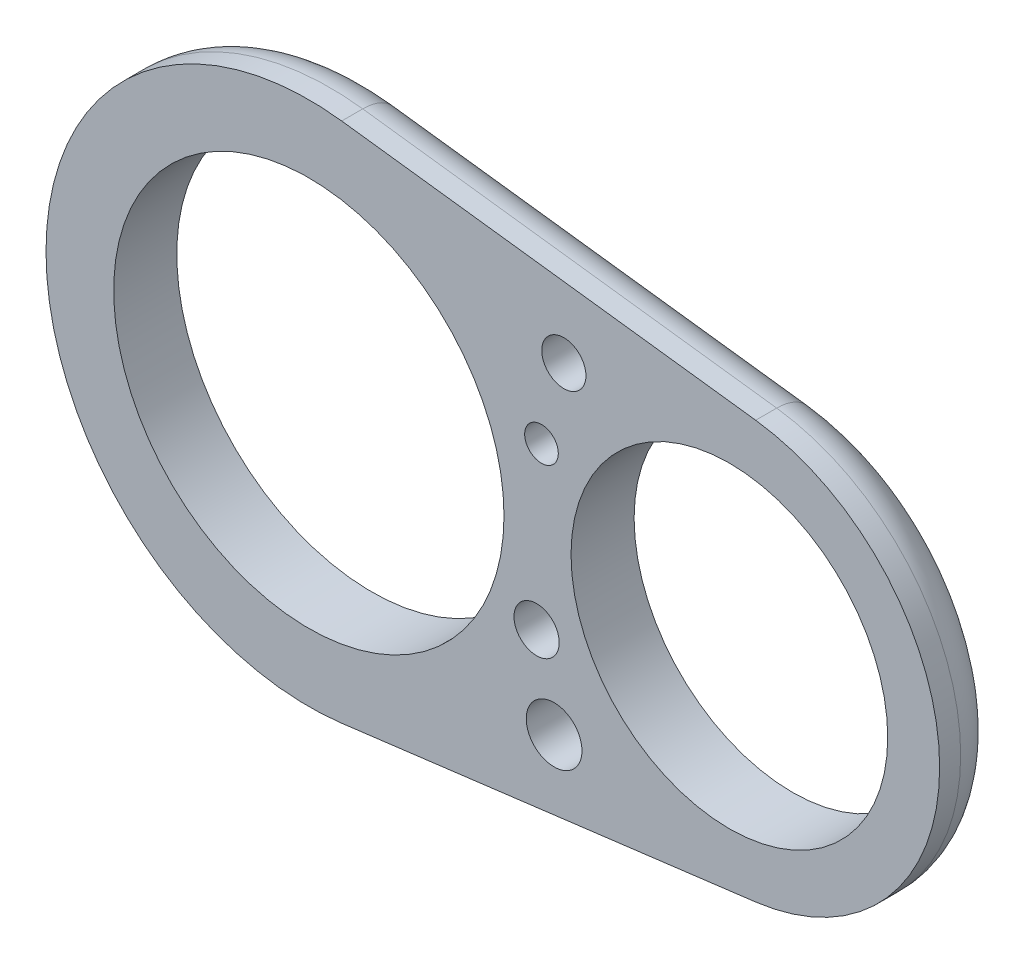
ISO-10303-21;
HEADER;
FILE_DESCRIPTION(('STEP AP214'),'2;1');
FILE_NAME('part.step','',(''),(''),'','','');
FILE_SCHEMA(('AUTOMOTIVE_DESIGN { 1 0 10303 214 1 1 1 1 }'));
ENDSEC;
DATA;
#1=APPLICATION_CONTEXT('core data for automotive mechanical design processes');
#2=APPLICATION_PROTOCOL_DEFINITION('international standard','automotive_design',2000,#1);
#3=PRODUCT_CONTEXT('',#1,'mechanical');
#4=PRODUCT('Part','Part','',(#3));
#5=PRODUCT_RELATED_PRODUCT_CATEGORY('part','',(#4));
#6=PRODUCT_DEFINITION_FORMATION('','',#4);
#7=PRODUCT_DEFINITION_CONTEXT('part definition',#1,'design');
#8=PRODUCT_DEFINITION('design','',#6,#7);
#9=PRODUCT_DEFINITION_SHAPE('','',#8);
#10=(LENGTH_UNIT() NAMED_UNIT(*) SI_UNIT(.MILLI.,.METRE.));
#11=(NAMED_UNIT(*) PLANE_ANGLE_UNIT() SI_UNIT($,.RADIAN.));
#12=(NAMED_UNIT(*) SI_UNIT($,.STERADIAN.) SOLID_ANGLE_UNIT());
#13=UNCERTAINTY_MEASURE_WITH_UNIT(LENGTH_MEASURE(1.E-05),#10,'distance_accuracy_value','');
#14=(GEOMETRIC_REPRESENTATION_CONTEXT(3) GLOBAL_UNCERTAINTY_ASSIGNED_CONTEXT((#13)) GLOBAL_UNIT_ASSIGNED_CONTEXT((#10,
#11,#12)) REPRESENTATION_CONTEXT('',''));
#15=CARTESIAN_POINT('',(0.,0.,0.));
#16=DIRECTION('',(0.,0.,1.));
#17=DIRECTION('',(1.,0.,0.));
#18=AXIS2_PLACEMENT_3D('',#15,#16,#17);
#19=CARTESIAN_POINT('',(3.125,-24.8039185412305,6.));
#20=DIRECTION('',(-0.125,0.992156741649221,0.));
#21=DIRECTION('',(-0.992156741649222,-0.125,0.));
#22=AXIS2_PLACEMENT_3D('',#19,#20,#21);
#23=PLANE('',#22);
#24=DIRECTION('',(0.,0.,-1.));
#25=VECTOR('',#24,1.);
#26=CARTESIAN_POINT('',(3.125,-24.8039185412305,6.));
#27=LINE('',#26,#25);
#28=CARTESIAN_POINT('',(3.125,-24.8039185412305,6.));
#29=VERTEX_POINT('',#28);
#30=CARTESIAN_POINT('',(3.125,-24.8039185412305,4.));
#31=VERTEX_POINT('',#30);
#32=EDGE_CURVE('E205',#29,#31,#27,.T.);
#33=ORIENTED_EDGE('',*,*,#32,.T.);
#34=DIRECTION('',(0.992156741649222,0.125,0.));
#35=VECTOR('',#34,1.);
#36=CARTESIAN_POINT('',(3.125,-24.8039185412305,4.));
#37=LINE('',#36,#35);
#38=CARTESIAN_POINT('',(42.5,-19.8431348329844,4.));
#39=VERTEX_POINT('',#38);
#40=EDGE_CURVE('E63',#31,#39,#37,.T.);
#41=ORIENTED_EDGE('',*,*,#40,.T.);
#42=DIRECTION('',(0.,0.,-1.));
#43=VECTOR('',#42,1.);
#44=CARTESIAN_POINT('',(42.5,-19.8431348329844,6.));
#45=LINE('',#44,#43);
#46=CARTESIAN_POINT('',(42.5,-19.8431348329844,6.));
#47=VERTEX_POINT('',#46);
#48=EDGE_CURVE('E101',#47,#39,#45,.T.);
#49=ORIENTED_EDGE('',*,*,#48,.F.);
#50=DIRECTION('',(0.992156741649222,0.125,0.));
#51=VECTOR('',#50,1.);
#52=CARTESIAN_POINT('',(3.125,-24.8039185412305,6.));
#53=LINE('',#52,#51);
#54=EDGE_CURVE('E107',#29,#47,#53,.T.);
#55=ORIENTED_EDGE('',*,*,#54,.F.);
#56=EDGE_LOOP('',(#33,#41,#49,#55));
#57=FACE_BOUND('',#56,.T.);
#58=ADVANCED_FACE('F39',(#57),#23,.F.);
#59=CARTESIAN_POINT('',(40.,0.,6.));
#60=DIRECTION('',(0.,0.,-1.));
#61=DIRECTION('',(-1.,0.,0.));
#62=AXIS2_PLACEMENT_3D('',#59,#60,#61);
#63=CYLINDRICAL_SURFACE('',#62,20.);
#64=ORIENTED_EDGE('',*,*,#48,.T.);
#65=CARTESIAN_POINT('',(40.,0.,4.));
#66=DIRECTION('',(0.,0.,1.));
#67=DIRECTION('',(1.,0.,0.));
#68=AXIS2_PLACEMENT_3D('',#65,#66,#67);
#69=CIRCLE('',#68,20.);
#70=CARTESIAN_POINT('',(42.5,19.8431348329844,4.));
#71=VERTEX_POINT('',#70);
#72=EDGE_CURVE('E48',#39,#71,#69,.T.);
#73=ORIENTED_EDGE('',*,*,#72,.T.);
#74=DIRECTION('',(0.,0.,-1.));
#75=VECTOR('',#74,1.);
#76=CARTESIAN_POINT('',(42.5,19.8431348329844,6.));
#77=LINE('',#76,#75);
#78=CARTESIAN_POINT('',(42.5,19.8431348329844,6.));
#79=VERTEX_POINT('',#78);
#80=EDGE_CURVE('E102',#79,#71,#77,.T.);
#81=ORIENTED_EDGE('',*,*,#80,.F.);
#82=CARTESIAN_POINT('',(40.,0.,6.));
#83=DIRECTION('',(0.,0.,1.));
#84=DIRECTION('',(1.,0.,0.));
#85=AXIS2_PLACEMENT_3D('',#82,#83,#84);
#86=CIRCLE('',#85,20.);
#87=EDGE_CURVE('E98',#47,#79,#86,.T.);
#88=ORIENTED_EDGE('',*,*,#87,.F.);
#89=EDGE_LOOP('',(#64,#73,#81,#88));
#90=FACE_BOUND('',#89,.T.);
#91=ADVANCED_FACE('F100',(#90),#63,.T.);
#92=CARTESIAN_POINT('',(3.125,24.8039185412305,6.));
#93=DIRECTION('',(0.125,0.992156741649221,0.));
#94=DIRECTION('',(-0.992156741649222,0.125,0.));
#95=AXIS2_PLACEMENT_3D('',#92,#93,#94);
#96=PLANE('',#95);
#97=ORIENTED_EDGE('',*,*,#80,.T.);
#98=DIRECTION('',(0.992156741649222,-0.125,0.));
#99=VECTOR('',#98,1.);
#100=CARTESIAN_POINT('',(3.125,24.8039185412305,4.));
#101=LINE('',#100,#99);
#102=CARTESIAN_POINT('',(3.125,24.8039185412305,4.));
#103=VERTEX_POINT('',#102);
#104=EDGE_CURVE('E11',#71,#103,#101,.F.);
#105=ORIENTED_EDGE('',*,*,#104,.T.);
#106=DIRECTION('',(0.,0.,-1.));
#107=VECTOR('',#106,1.);
#108=CARTESIAN_POINT('',(3.125,24.8039185412305,6.));
#109=LINE('',#108,#107);
#110=CARTESIAN_POINT('',(3.125,24.8039185412305,6.));
#111=VERTEX_POINT('',#110);
#112=EDGE_CURVE('E121',#111,#103,#109,.T.);
#113=ORIENTED_EDGE('',*,*,#112,.F.);
#114=DIRECTION('',(0.992156741649222,-0.125,0.));
#115=VECTOR('',#114,1.);
#116=CARTESIAN_POINT('',(3.125,24.8039185412305,6.));
#117=LINE('',#116,#115);
#118=EDGE_CURVE('E106',#111,#79,#117,.T.);
#119=ORIENTED_EDGE('',*,*,#118,.T.);
#120=EDGE_LOOP('',(#97,#105,#113,#119));
#121=FACE_BOUND('',#120,.T.);
#122=ADVANCED_FACE('F170',(#121),#96,.T.);
#123=CARTESIAN_POINT('',(40.,0.,6.));
#124=DIRECTION('',(0.,0.,-1.));
#125=DIRECTION('',(-1.,0.,0.));
#126=AXIS2_PLACEMENT_3D('',#123,#124,#125);
#127=CYLINDRICAL_SURFACE('',#126,15.0625);
#128=CARTESIAN_POINT('',(40.,0.,6.));
#129=DIRECTION('',(0.,0.,1.));
#130=DIRECTION('',(1.,0.,0.));
#131=AXIS2_PLACEMENT_3D('',#128,#129,#130);
#132=CIRCLE('',#131,15.0625);
#133=CARTESIAN_POINT('',(55.0625,0.,6.));
#134=VERTEX_POINT('',#133);
#135=EDGE_CURVE('E114',#134,#134,#132,.T.);
#136=ORIENTED_EDGE('',*,*,#135,.T.);
#137=EDGE_LOOP('',(#136));
#138=FACE_BOUND('',#137,.T.);
#139=CARTESIAN_POINT('',(40.,0.,0.));
#140=DIRECTION('',(0.,0.,1.));
#141=DIRECTION('',(1.,0.,0.));
#142=AXIS2_PLACEMENT_3D('',#139,#140,#141);
#143=CIRCLE('',#142,15.0625);
#144=CARTESIAN_POINT('',(55.0625,0.,0.));
#145=VERTEX_POINT('',#144);
#146=EDGE_CURVE('E194',#145,#145,#143,.T.);
#147=ORIENTED_EDGE('',*,*,#146,.F.);
#148=EDGE_LOOP('',(#147));
#149=FACE_BOUND('',#148,.T.);
#150=ADVANCED_FACE('F174',(#138,#149),#127,.F.);
#151=CARTESIAN_POINT('',(0.,0.,6.));
#152=DIRECTION('',(0.,0.,-1.));
#153=DIRECTION('',(-1.,0.,0.));
#154=AXIS2_PLACEMENT_3D('',#151,#152,#153);
#155=CYLINDRICAL_SURFACE('',#154,18.5625);
#156=CARTESIAN_POINT('',(0.,0.,6.));
#157=DIRECTION('',(0.,0.,1.));
#158=DIRECTION('',(1.,0.,0.));
#159=AXIS2_PLACEMENT_3D('',#156,#157,#158);
#160=CIRCLE('',#159,18.5625);
#161=CARTESIAN_POINT('',(18.5625,0.,6.));
#162=VERTEX_POINT('',#161);
#163=EDGE_CURVE('E189',#162,#162,#160,.T.);
#164=ORIENTED_EDGE('',*,*,#163,.T.);
#165=EDGE_LOOP('',(#164));
#166=FACE_BOUND('',#165,.T.);
#167=CARTESIAN_POINT('',(0.,0.,0.));
#168=DIRECTION('',(0.,0.,1.));
#169=DIRECTION('',(1.,0.,0.));
#170=AXIS2_PLACEMENT_3D('',#167,#168,#169);
#171=CIRCLE('',#170,18.5625);
#172=CARTESIAN_POINT('',(18.5625,0.,0.));
#173=VERTEX_POINT('',#172);
#174=EDGE_CURVE('E192',#173,#173,#171,.T.);
#175=ORIENTED_EDGE('',*,*,#174,.F.);
#176=EDGE_LOOP('',(#175));
#177=FACE_BOUND('',#176,.T.);
#178=ADVANCED_FACE('F176',(#166,#177),#155,.F.);
#179=CARTESIAN_POINT('',(23.3265870530841,-15.6503616117409,6.));
#180=DIRECTION('',(0.,0.,-1.));
#181=DIRECTION('',(-1.,0.,0.));
#182=AXIS2_PLACEMENT_3D('',#179,#180,#181);
#183=CYLINDRICAL_SURFACE('',#182,2.65);
#184=CARTESIAN_POINT('',(23.3265870530841,-15.6503616117409,6.));
#185=DIRECTION('',(0.,0.,1.));
#186=DIRECTION('',(1.,0.,0.));
#187=AXIS2_PLACEMENT_3D('',#184,#185,#186);
#188=CIRCLE('',#187,2.65);
#189=CARTESIAN_POINT('',(25.9765870530841,-15.6503616117409,6.));
#190=VERTEX_POINT('',#189);
#191=EDGE_CURVE('E269',#190,#190,#188,.T.);
#192=ORIENTED_EDGE('',*,*,#191,.T.);
#193=EDGE_LOOP('',(#192));
#194=FACE_BOUND('',#193,.T.);
#195=CARTESIAN_POINT('',(23.3265870530841,-15.6503616117409,0.));
#196=DIRECTION('',(0.,0.,1.));
#197=DIRECTION('',(1.,0.,0.));
#198=AXIS2_PLACEMENT_3D('',#195,#196,#197);
#199=CIRCLE('',#198,2.65);
#200=CARTESIAN_POINT('',(24.3381656401643,-18.0996898384514,0.));
#201=VERTEX_POINT('',#200);
#202=CARTESIAN_POINT('',(22.9541496750108,-18.2740594600866,0.));
#203=VERTEX_POINT('',#202);
#204=EDGE_CURVE('E195',#201,#203,#199,.T.);
#205=ORIENTED_EDGE('',*,*,#204,.F.);
#206=CARTESIAN_POINT('',(24.3381656401643,-18.0996898384514,0.));
#207=CARTESIAN_POINT('',(24.2685522185977,-18.1284493286051,1.53270224891106E-05));
#208=CARTESIAN_POINT('',(24.1977076804701,-18.1542253498857,0.000148109373221071));
#209=CARTESIAN_POINT('',(24.054063917627,-18.1996638171458,0.000479762136126874));
#210=CARTESIAN_POINT('',(23.9812641853181,-18.2193246585498,0.000678649865565661));
#211=CARTESIAN_POINT('',(23.8358637508439,-18.2520091753251,0.000970278244846451));
#212=CARTESIAN_POINT('',(23.7632935794689,-18.2651687249884,0.00106524728192816));
#213=CARTESIAN_POINT('',(23.617339546089,-18.2853929126759,0.00110812896366931));
#214=CARTESIAN_POINT('',(23.5439560054715,-18.292459876811,0.00105609776457781));
#215=CARTESIAN_POINT('',(23.3848299328035,-18.3011057689296,0.000806805484035291));
#216=CARTESIAN_POINT('',(23.2990265973154,-18.3015997048466,0.000587210251060834));
#217=CARTESIAN_POINT('',(23.1266597955128,-18.2942393022922,0.00019718926661672));
#218=CARTESIAN_POINT('',(23.0401009624534,-18.2862762721425,2.74403592826031E-05));
#219=CARTESIAN_POINT('',(22.9541496750108,-18.2740594600866,0.));
#220=B_SPLINE_CURVE_WITH_KNOTS('',3,(#206,#207,#208,#209,#210,#211,#212,#213,#214,#215,#216,
#217,#218,#219),.UNSPECIFIED.,.F.,.F.,(4,2,2,2,2,2,4),(0.,0.225890833138887,0.451840888366353,
0.672844597475655,0.893763891339475,1.15076899135322,1.4111176362642),.UNSPECIFIED.);
#221=EDGE_CURVE('E136',#201,#203,#220,.T.);
#222=ORIENTED_EDGE('',*,*,#221,.T.);
#223=EDGE_LOOP('',(#205,#222));
#224=FACE_BOUND('',#223,.T.);
#225=ADVANCED_FACE('F144',(#194,#224),#183,.F.);
#226=CARTESIAN_POINT('',(24.253343553912,15.4243012357901,6.));
#227=DIRECTION('',(0.,0.,-1.));
#228=DIRECTION('',(-1.,0.,0.));
#229=AXIS2_PLACEMENT_3D('',#226,#227,#228);
#230=CYLINDRICAL_SURFACE('',#229,2.1);
#231=CARTESIAN_POINT('',(24.253343553912,15.4243012357901,6.));
#232=DIRECTION('',(0.,0.,1.));
#233=DIRECTION('',(1.,0.,0.));
#234=AXIS2_PLACEMENT_3D('',#231,#232,#233);
#235=CIRCLE('',#234,2.1);
#236=CARTESIAN_POINT('',(26.353343553912,15.4243012357901,6.));
#237=VERTEX_POINT('',#236);
#238=EDGE_CURVE('E265',#237,#237,#235,.T.);
#239=ORIENTED_EDGE('',*,*,#238,.T.);
#240=EDGE_LOOP('',(#239));
#241=FACE_BOUND('',#240,.T.);
#242=CARTESIAN_POINT('',(24.253343553912,15.4243012357901,0.));
#243=DIRECTION('',(0.,0.,1.));
#244=DIRECTION('',(1.,0.,0.));
#245=AXIS2_PLACEMENT_3D('',#242,#243,#244);
#246=CIRCLE('',#245,2.1);
#247=CARTESIAN_POINT('',(26.353343553912,15.4243012357901,0.));
#248=VERTEX_POINT('',#247);
#249=EDGE_CURVE('E201',#248,#248,#246,.T.);
#250=ORIENTED_EDGE('',*,*,#249,.F.);
#251=EDGE_LOOP('',(#250));
#252=FACE_BOUND('',#251,.T.);
#253=ADVANCED_FACE('F184',(#241,#252),#230,.F.);
#254=CARTESIAN_POINT('',(22.126671776956,7.71215061789504,6.));
#255=DIRECTION('',(0.,0.,-1.));
#256=DIRECTION('',(-1.,0.,0.));
#257=AXIS2_PLACEMENT_3D('',#254,#255,#256);
#258=CYLINDRICAL_SURFACE('',#257,1.6);
#259=CARTESIAN_POINT('',(22.126671776956,7.71215061789504,6.));
#260=DIRECTION('',(0.,0.,1.));
#261=DIRECTION('',(1.,0.,0.));
#262=AXIS2_PLACEMENT_3D('',#259,#260,#261);
#263=CIRCLE('',#262,1.6);
#264=CARTESIAN_POINT('',(23.726671776956,7.71215061789504,6.));
#265=VERTEX_POINT('',#264);
#266=EDGE_CURVE('E262',#265,#265,#263,.T.);
#267=ORIENTED_EDGE('',*,*,#266,.T.);
#268=EDGE_LOOP('',(#267));
#269=FACE_BOUND('',#268,.T.);
#270=CARTESIAN_POINT('',(22.126671776956,7.71215061789504,0.));
#271=DIRECTION('',(0.,0.,1.));
#272=DIRECTION('',(1.,0.,0.));
#273=AXIS2_PLACEMENT_3D('',#270,#271,#272);
#274=CIRCLE('',#273,1.6);
#275=CARTESIAN_POINT('',(23.726671776956,7.71215061789504,0.));
#276=VERTEX_POINT('',#275);
#277=EDGE_CURVE('E231',#276,#276,#274,.T.);
#278=ORIENTED_EDGE('',*,*,#277,.F.);
#279=EDGE_LOOP('',(#278));
#280=FACE_BOUND('',#279,.T.);
#281=ADVANCED_FACE('F243',(#269,#280),#258,.F.);
#282=CARTESIAN_POINT('',(21.663293526542,-7.82518080587045,6.));
#283=DIRECTION('',(0.,0.,-1.));
#284=DIRECTION('',(-1.,0.,0.));
#285=AXIS2_PLACEMENT_3D('',#282,#283,#284);
#286=CYLINDRICAL_SURFACE('',#285,2.15);
#287=CARTESIAN_POINT('',(21.663293526542,-7.82518080587045,6.));
#288=DIRECTION('',(0.,0.,1.));
#289=DIRECTION('',(1.,0.,0.));
#290=AXIS2_PLACEMENT_3D('',#287,#288,#289);
#291=CIRCLE('',#290,2.15);
#292=CARTESIAN_POINT('',(23.813293526542,-7.82518080587045,6.));
#293=VERTEX_POINT('',#292);
#294=EDGE_CURVE('E198',#293,#293,#291,.T.);
#295=ORIENTED_EDGE('',*,*,#294,.T.);
#296=EDGE_LOOP('',(#295));
#297=FACE_BOUND('',#296,.T.);
#298=CARTESIAN_POINT('',(21.663293526542,-7.82518080587045,0.));
#299=DIRECTION('',(0.,0.,1.));
#300=DIRECTION('',(1.,0.,0.));
#301=AXIS2_PLACEMENT_3D('',#298,#299,#300);
#302=CIRCLE('',#301,2.15);
#303=CARTESIAN_POINT('',(23.813293526542,-7.82518080587045,0.));
#304=VERTEX_POINT('',#303);
#305=EDGE_CURVE('E228',#304,#304,#302,.T.);
#306=ORIENTED_EDGE('',*,*,#305,.F.);
#307=EDGE_LOOP('',(#306));
#308=FACE_BOUND('',#307,.T.);
#309=ADVANCED_FACE('F248',(#297,#308),#286,.F.);
#310=CARTESIAN_POINT('',(0.,0.,6.));
#311=DIRECTION('',(0.,0.,-1.));
#312=DIRECTION('',(-1.,0.,0.));
#313=AXIS2_PLACEMENT_3D('',#310,#311,#312);
#314=CYLINDRICAL_SURFACE('',#313,25.);
#315=ORIENTED_EDGE('',*,*,#112,.T.);
#316=CARTESIAN_POINT('',(0.,0.,4.));
#317=DIRECTION('',(0.,0.,1.));
#318=DIRECTION('',(1.,0.,0.));
#319=AXIS2_PLACEMENT_3D('',#316,#317,#318);
#320=CIRCLE('',#319,25.);
#321=EDGE_CURVE('E116',#103,#31,#320,.T.);
#322=ORIENTED_EDGE('',*,*,#321,.T.);
#323=ORIENTED_EDGE('',*,*,#32,.F.);
#324=CARTESIAN_POINT('',(0.,0.,6.));
#325=DIRECTION('',(0.,0.,1.));
#326=DIRECTION('',(1.,0.,0.));
#327=AXIS2_PLACEMENT_3D('',#324,#325,#326);
#328=CIRCLE('',#327,25.);
#329=EDGE_CURVE('E112',#111,#29,#328,.T.);
#330=ORIENTED_EDGE('',*,*,#329,.F.);
#331=EDGE_LOOP('',(#315,#322,#323,#330));
#332=FACE_BOUND('',#331,.T.);
#333=ADVANCED_FACE('F209',(#332),#314,.T.);
#334=CARTESIAN_POINT('',(0.,0.,6.));
#335=DIRECTION('',(0.,0.,1.));
#336=DIRECTION('',(1.,0.,0.));
#337=AXIS2_PLACEMENT_3D('',#334,#335,#336);
#338=PLANE('',#337);
#339=ORIENTED_EDGE('',*,*,#294,.F.);
#340=EDGE_LOOP('',(#339));
#341=FACE_BOUND('',#340,.T.);
#342=ORIENTED_EDGE('',*,*,#266,.F.);
#343=EDGE_LOOP('',(#342));
#344=FACE_BOUND('',#343,.T.);
#345=ORIENTED_EDGE('',*,*,#238,.F.);
#346=EDGE_LOOP('',(#345));
#347=FACE_BOUND('',#346,.T.);
#348=ORIENTED_EDGE('',*,*,#191,.F.);
#349=EDGE_LOOP('',(#348));
#350=FACE_BOUND('',#349,.T.);
#351=ORIENTED_EDGE('',*,*,#163,.F.);
#352=EDGE_LOOP('',(#351));
#353=FACE_BOUND('',#352,.T.);
#354=ORIENTED_EDGE('',*,*,#135,.F.);
#355=EDGE_LOOP('',(#354));
#356=FACE_BOUND('',#355,.T.);
#357=ORIENTED_EDGE('',*,*,#54,.T.);
#358=ORIENTED_EDGE('',*,*,#87,.T.);
#359=ORIENTED_EDGE('',*,*,#118,.F.);
#360=ORIENTED_EDGE('',*,*,#329,.T.);
#361=EDGE_LOOP('',(#357,#358,#359,#360));
#362=FACE_BOUND('',#361,.T.);
#363=ADVANCED_FACE('F110',(#341,#344,#347,#350,#353,#356,#362),#338,.T.);
#364=CARTESIAN_POINT('',(0.,0.,0.));
#365=DIRECTION('',(0.,0.,1.));
#366=DIRECTION('',(1.,0.,0.));
#367=AXIS2_PLACEMENT_3D('',#364,#365,#366);
#368=PLANE('',#367);
#369=ORIENTED_EDGE('',*,*,#204,.T.);
#370=DIRECTION('',(0.992156741649222,0.125,0.));
#371=VECTOR('',#370,1.);
#372=CARTESIAN_POINT('',(2.625,-20.8352915746337,0.));
#373=LINE('',#372,#371);
#374=CARTESIAN_POINT('',(2.625,-20.8352915746337,0.));
#375=VERTEX_POINT('',#374);
#376=EDGE_CURVE('E133',#203,#375,#373,.F.);
#377=ORIENTED_EDGE('',*,*,#376,.T.);
#378=CARTESIAN_POINT('',(0.,0.,0.));
#379=DIRECTION('',(0.,0.,1.));
#380=DIRECTION('',(1.,0.,0.));
#381=AXIS2_PLACEMENT_3D('',#378,#379,#380);
#382=CIRCLE('',#381,21.);
#383=CARTESIAN_POINT('',(2.625,20.8352915746336,0.));
#384=VERTEX_POINT('',#383);
#385=EDGE_CURVE('E130',#375,#384,#382,.F.);
#386=ORIENTED_EDGE('',*,*,#385,.T.);
#387=DIRECTION('',(0.992156741649222,-0.125,0.));
#388=VECTOR('',#387,1.);
#389=CARTESIAN_POINT('',(42.,15.8745078663875,0.));
#390=LINE('',#389,#388);
#391=CARTESIAN_POINT('',(42.,15.8745078663875,0.));
#392=VERTEX_POINT('',#391);
#393=EDGE_CURVE('E119',#384,#392,#390,.T.);
#394=ORIENTED_EDGE('',*,*,#393,.T.);
#395=CARTESIAN_POINT('',(40.,0.,0.));
#396=DIRECTION('',(0.,0.,1.));
#397=DIRECTION('',(1.,0.,0.));
#398=AXIS2_PLACEMENT_3D('',#395,#396,#397);
#399=CIRCLE('',#398,16.);
#400=CARTESIAN_POINT('',(42.,-15.8745078663875,0.));
#401=VERTEX_POINT('',#400);
#402=EDGE_CURVE('E126',#392,#401,#399,.F.);
#403=ORIENTED_EDGE('',*,*,#402,.T.);
#404=DIRECTION('',(0.992156741649222,0.125,0.));
#405=VECTOR('',#404,1.);
#406=CARTESIAN_POINT('',(2.625,-20.8352915746337,0.));
#407=LINE('',#406,#405);
#408=EDGE_CURVE('E128',#401,#201,#407,.F.);
#409=ORIENTED_EDGE('',*,*,#408,.T.);
#410=EDGE_LOOP('',(#369,#377,#386,#394,#403,#409));
#411=FACE_BOUND('',#410,.T.);
#412=ORIENTED_EDGE('',*,*,#305,.T.);
#413=EDGE_LOOP('',(#412));
#414=FACE_BOUND('',#413,.T.);
#415=ORIENTED_EDGE('',*,*,#277,.T.);
#416=EDGE_LOOP('',(#415));
#417=FACE_BOUND('',#416,.T.);
#418=ORIENTED_EDGE('',*,*,#249,.T.);
#419=EDGE_LOOP('',(#418));
#420=FACE_BOUND('',#419,.T.);
#421=ORIENTED_EDGE('',*,*,#174,.T.);
#422=EDGE_LOOP('',(#421));
#423=FACE_BOUND('',#422,.T.);
#424=ORIENTED_EDGE('',*,*,#146,.T.);
#425=EDGE_LOOP('',(#424));
#426=FACE_BOUND('',#425,.T.);
#427=ADVANCED_FACE('F161',(#411,#414,#417,#420,#423,#426),#368,.F.);
#428=CARTESIAN_POINT('',(40.,0.,4.));
#429=DIRECTION('',(0.,0.,1.));
#430=DIRECTION('',(1.,0.,0.));
#431=AXIS2_PLACEMENT_3D('',#428,#429,#430);
#432=TOROIDAL_SURFACE('',#431,16.,4.);
#433=CARTESIAN_POINT('',(42.,-15.8745078663875,4.));
#434=DIRECTION('',(-0.992156741649221,-0.125,0.));
#435=DIRECTION('',(0.125,-0.992156741649222,0.));
#436=AXIS2_PLACEMENT_3D('',#433,#434,#435);
#437=CIRCLE('',#436,4.);
#438=EDGE_CURVE('E217',#401,#39,#437,.T.);
#439=ORIENTED_EDGE('',*,*,#438,.F.);
#440=ORIENTED_EDGE('',*,*,#402,.F.);
#441=CARTESIAN_POINT('',(42.,15.8745078663875,4.));
#442=DIRECTION('',(-0.992156741649221,0.125,0.));
#443=DIRECTION('',(-0.125,-0.992156741649222,0.));
#444=AXIS2_PLACEMENT_3D('',#441,#442,#443);
#445=CIRCLE('',#444,4.);
#446=EDGE_CURVE('E43',#71,#392,#445,.T.);
#447=ORIENTED_EDGE('',*,*,#446,.F.);
#448=ORIENTED_EDGE('',*,*,#72,.F.);
#449=EDGE_LOOP('',(#439,#440,#447,#448));
#450=FACE_BOUND('',#449,.T.);
#451=ADVANCED_FACE('F41',(#450),#432,.T.);
#452=CARTESIAN_POINT('',(2.625,20.8352915746336,4.));
#453=DIRECTION('',(-0.992156741649222,0.125,0.));
#454=DIRECTION('',(-0.125,-0.992156741649221,0.));
#455=AXIS2_PLACEMENT_3D('',#452,#453,#454);
#456=CYLINDRICAL_SURFACE('',#455,4.);
#457=ORIENTED_EDGE('',*,*,#446,.T.);
#458=ORIENTED_EDGE('',*,*,#393,.F.);
#459=CARTESIAN_POINT('',(2.625,20.8352915746336,4.));
#460=DIRECTION('',(-0.992156741649221,0.125,0.));
#461=DIRECTION('',(-0.125,-0.992156741649221,0.));
#462=AXIS2_PLACEMENT_3D('',#459,#460,#461);
#463=CIRCLE('',#462,4.);
#464=EDGE_CURVE('E214',#103,#384,#463,.T.);
#465=ORIENTED_EDGE('',*,*,#464,.F.);
#466=ORIENTED_EDGE('',*,*,#104,.F.);
#467=EDGE_LOOP('',(#457,#458,#465,#466));
#468=FACE_BOUND('',#467,.T.);
#469=ADVANCED_FACE('F153',(#468),#456,.T.);
#470=CARTESIAN_POINT('',(2.625,-20.8352915746337,4.));
#471=DIRECTION('',(0.992156741649222,0.125,0.));
#472=DIRECTION('',(-0.125,0.992156741649221,0.));
#473=AXIS2_PLACEMENT_3D('',#470,#471,#472);
#474=CYLINDRICAL_SURFACE('',#473,4.);
#475=ORIENTED_EDGE('',*,*,#438,.T.);
#476=ORIENTED_EDGE('',*,*,#40,.F.);
#477=CARTESIAN_POINT('',(2.625,-20.8352915746337,4.));
#478=DIRECTION('',(-0.992156741649221,-0.125,0.));
#479=DIRECTION('',(0.125,-0.992156741649221,0.));
#480=AXIS2_PLACEMENT_3D('',#477,#478,#479);
#481=CIRCLE('',#480,4.);
#482=EDGE_CURVE('E218',#375,#31,#481,.T.);
#483=ORIENTED_EDGE('',*,*,#482,.F.);
#484=ORIENTED_EDGE('',*,*,#376,.F.);
#485=ORIENTED_EDGE('',*,*,#221,.F.);
#486=ORIENTED_EDGE('',*,*,#408,.F.);
#487=EDGE_LOOP('',(#475,#476,#483,#484,#485,#486));
#488=FACE_BOUND('',#487,.T.);
#489=ADVANCED_FACE('F148',(#488),#474,.T.);
#490=CARTESIAN_POINT('',(0.,0.,4.));
#491=DIRECTION('',(0.,0.,1.));
#492=DIRECTION('',(1.,0.,0.));
#493=AXIS2_PLACEMENT_3D('',#490,#491,#492);
#494=TOROIDAL_SURFACE('',#493,21.,4.);
#495=ORIENTED_EDGE('',*,*,#464,.T.);
#496=ORIENTED_EDGE('',*,*,#385,.F.);
#497=ORIENTED_EDGE('',*,*,#482,.T.);
#498=ORIENTED_EDGE('',*,*,#321,.F.);
#499=EDGE_LOOP('',(#495,#496,#497,#498));
#500=FACE_BOUND('',#499,.T.);
#501=ADVANCED_FACE('F152',(#500),#494,.T.);
#502=CLOSED_SHELL('',(#58,#91,#122,#150,#178,#225,#253,#281,#309,#333,#363,#427,#451,#469,#489,#501));
#503=MANIFOLD_SOLID_BREP('B2',#502);
#504=ADVANCED_BREP_SHAPE_REPRESENTATION('',(#18,#503),#14);
#505=SHAPE_DEFINITION_REPRESENTATION(#9,#504);
ENDSEC;
END-ISO-10303-21;
